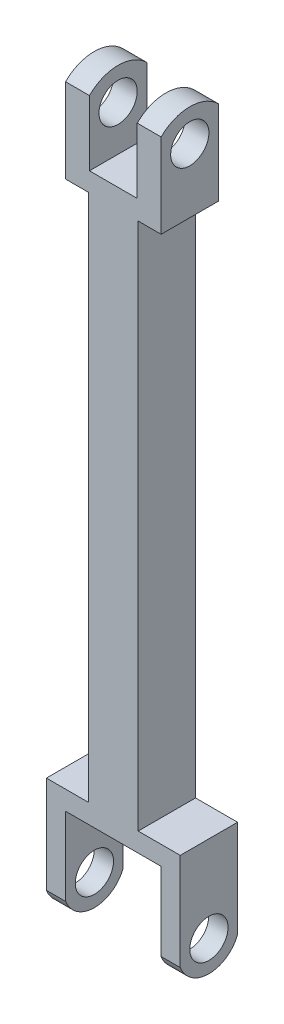
ISO-10303-21;
HEADER;
FILE_DESCRIPTION(('STEP AP214'),'2;1');
FILE_NAME('part.step','',(''),(''),'','','');
FILE_SCHEMA(('AUTOMOTIVE_DESIGN { 1 0 10303 214 1 1 1 1 }'));
ENDSEC;
DATA;
#1=APPLICATION_CONTEXT('core data for automotive mechanical design processes');
#2=APPLICATION_PROTOCOL_DEFINITION('international standard','automotive_design',2000,#1);
#3=PRODUCT_CONTEXT('',#1,'mechanical');
#4=PRODUCT('Part','Part','',(#3));
#5=PRODUCT_RELATED_PRODUCT_CATEGORY('part','',(#4));
#6=PRODUCT_DEFINITION_FORMATION('','',#4);
#7=PRODUCT_DEFINITION_CONTEXT('part definition',#1,'design');
#8=PRODUCT_DEFINITION('design','',#6,#7);
#9=PRODUCT_DEFINITION_SHAPE('','',#8);
#10=(LENGTH_UNIT() NAMED_UNIT(*) SI_UNIT(.MILLI.,.METRE.));
#11=(NAMED_UNIT(*) PLANE_ANGLE_UNIT() SI_UNIT($,.RADIAN.));
#12=(NAMED_UNIT(*) SI_UNIT($,.STERADIAN.) SOLID_ANGLE_UNIT());
#13=UNCERTAINTY_MEASURE_WITH_UNIT(LENGTH_MEASURE(1.E-05),#10,'distance_accuracy_value','');
#14=(GEOMETRIC_REPRESENTATION_CONTEXT(3) GLOBAL_UNCERTAINTY_ASSIGNED_CONTEXT((#13)) GLOBAL_UNIT_ASSIGNED_CONTEXT((#10,
#11,#12)) REPRESENTATION_CONTEXT('',''));
#15=CARTESIAN_POINT('',(0.,0.,0.));
#16=DIRECTION('',(0.,0.,1.));
#17=DIRECTION('',(1.,0.,0.));
#18=AXIS2_PLACEMENT_3D('',#15,#16,#17);
#19=CARTESIAN_POINT('',(2.99221219861622,70.4144146573449,1.5));
#20=DIRECTION('',(-1.,0.,0.));
#21=DIRECTION('',(0.,0.,1.));
#22=AXIS2_PLACEMENT_3D('',#19,#20,#21);
#23=CYLINDRICAL_SURFACE('',#22,1.);
#24=CARTESIAN_POINT('',(-9.75778780138378,70.4144146573449,1.5));
#25=DIRECTION('',(-1.,0.,0.));
#26=DIRECTION('',(0.,0.,1.));
#27=AXIS2_PLACEMENT_3D('',#24,#25,#26);
#28=CIRCLE('',#27,1.);
#29=CARTESIAN_POINT('',(-9.75778780138378,70.4144146573449,2.5));
#30=VERTEX_POINT('',#29);
#31=EDGE_CURVE('E242',#30,#30,#28,.F.);
#32=ORIENTED_EDGE('',*,*,#31,.T.);
#33=EDGE_LOOP('',(#32));
#34=FACE_BOUND('',#33,.T.);
#35=CARTESIAN_POINT('',(-11.0077878013838,70.4144146573449,1.5));
#36=DIRECTION('',(1.,0.,0.));
#37=DIRECTION('',(0.,1.,0.));
#38=AXIS2_PLACEMENT_3D('',#35,#36,#37);
#39=CIRCLE('',#38,1.);
#40=CARTESIAN_POINT('',(-11.0077878013838,71.4144146573449,1.5));
#41=VERTEX_POINT('',#40);
#42=EDGE_CURVE('E219',#41,#41,#39,.T.);
#43=ORIENTED_EDGE('',*,*,#42,.F.);
#44=EDGE_LOOP('',(#43));
#45=FACE_BOUND('',#44,.T.);
#46=ADVANCED_FACE('F37',(#34,#45),#23,.F.);
#47=CARTESIAN_POINT('',(2.99221219861622,69.966881410406,1.5));
#48=DIRECTION('',(-1.,0.,0.));
#49=DIRECTION('',(0.,0.,1.));
#50=AXIS2_PLACEMENT_3D('',#47,#48,#49);
#51=CYLINDRICAL_SURFACE('',#50,2.12414260230862);
#52=DIRECTION('',(-1.,0.,0.));
#53=VECTOR('',#52,1.);
#54=CARTESIAN_POINT('',(2.99221219861622,71.4708700390007,3.));
#55=LINE('',#54,#53);
#56=CARTESIAN_POINT('',(-9.75778780138378,71.4708700390007,3.));
#57=VERTEX_POINT('',#56);
#58=CARTESIAN_POINT('',(-11.0077878013838,71.4708700390007,3.));
#59=VERTEX_POINT('',#58);
#60=EDGE_CURVE('E233',#57,#59,#55,.T.);
#61=ORIENTED_EDGE('',*,*,#60,.F.);
#62=CARTESIAN_POINT('',(-9.75778780138378,69.966881410406,1.5));
#63=DIRECTION('',(-1.,0.,0.));
#64=DIRECTION('',(0.,0.,1.));
#65=AXIS2_PLACEMENT_3D('',#62,#63,#64);
#66=CIRCLE('',#65,2.12414260230862);
#67=CARTESIAN_POINT('',(-9.75778780138378,71.4708700390007,0.));
#68=VERTEX_POINT('',#67);
#69=EDGE_CURVE('E45',#57,#68,#66,.T.);
#70=ORIENTED_EDGE('',*,*,#69,.T.);
#71=DIRECTION('',(-1.,0.,0.));
#72=VECTOR('',#71,1.);
#73=CARTESIAN_POINT('',(2.99221219861622,71.4708700390007,0.));
#74=LINE('',#73,#72);
#75=CARTESIAN_POINT('',(-11.0077878013838,71.4708700390007,0.));
#76=VERTEX_POINT('',#75);
#77=EDGE_CURVE('E224',#68,#76,#74,.T.);
#78=ORIENTED_EDGE('',*,*,#77,.T.);
#79=CARTESIAN_POINT('',(-11.0077878013838,69.966881410406,1.5));
#80=DIRECTION('',(1.,0.,0.));
#81=DIRECTION('',(0.,1.,0.));
#82=AXIS2_PLACEMENT_3D('',#79,#80,#81);
#83=CIRCLE('',#82,2.12414260230862);
#84=EDGE_CURVE('E200',#59,#76,#83,.F.);
#85=ORIENTED_EDGE('',*,*,#84,.F.);
#86=EDGE_LOOP('',(#61,#70,#78,#85));
#87=FACE_BOUND('',#86,.T.);
#88=ADVANCED_FACE('F232',(#87),#51,.T.);
#89=CARTESIAN_POINT('',(-11.0077878013838,72.4285297549592,3.));
#90=DIRECTION('',(1.,0.,0.));
#91=DIRECTION('',(0.,1.,0.));
#92=AXIS2_PLACEMENT_3D('',#89,#90,#91);
#93=PLANE('',#92);
#94=ORIENTED_EDGE('',*,*,#42,.T.);
#95=EDGE_LOOP('',(#94));
#96=FACE_BOUND('',#95,.T.);
#97=DIRECTION('',(0.,-1.,0.));
#98=VECTOR('',#97,1.);
#99=CARTESIAN_POINT('',(-11.0077878013838,72.4285297549592,0.));
#100=LINE('',#99,#98);
#101=CARTESIAN_POINT('',(-11.0077878013838,67.061284765492,0.));
#102=VERTEX_POINT('',#101);
#103=EDGE_CURVE('E193',#76,#102,#100,.T.);
#104=ORIENTED_EDGE('',*,*,#103,.T.);
#105=DIRECTION('',(0.,0.,1.));
#106=VECTOR('',#105,1.);
#107=CARTESIAN_POINT('',(-11.0077878013838,67.061284765492,-0.001000000000001));
#108=LINE('',#107,#106);
#109=CARTESIAN_POINT('',(-11.0077878013838,67.061284765492,3.));
#110=VERTEX_POINT('',#109);
#111=EDGE_CURVE('E174',#102,#110,#108,.T.);
#112=ORIENTED_EDGE('',*,*,#111,.T.);
#113=DIRECTION('',(0.,-1.,0.));
#114=VECTOR('',#113,1.);
#115=CARTESIAN_POINT('',(-11.0077878013838,72.4285297549592,3.));
#116=LINE('',#115,#114);
#117=EDGE_CURVE('E203',#59,#110,#116,.T.);
#118=ORIENTED_EDGE('',*,*,#117,.F.);
#119=ORIENTED_EDGE('',*,*,#84,.T.);
#120=EDGE_LOOP('',(#104,#112,#118,#119));
#121=FACE_BOUND('',#120,.T.);
#122=ADVANCED_FACE('F39',(#96,#121),#93,.F.);
#123=CARTESIAN_POINT('',(-6.00778780138378,72.4285297549592,3.));
#124=DIRECTION('',(-1.,0.,0.));
#125=DIRECTION('',(0.,-1.,0.));
#126=AXIS2_PLACEMENT_3D('',#123,#124,#125);
#127=PLANE('',#126);
#128=CARTESIAN_POINT('',(-6.00778780138378,70.4144146573449,1.5));
#129=DIRECTION('',(-1.,0.,0.));
#130=DIRECTION('',(0.,-1.,0.));
#131=AXIS2_PLACEMENT_3D('',#128,#129,#130);
#132=CIRCLE('',#131,1.);
#133=CARTESIAN_POINT('',(-6.00778780138378,69.4144146573449,1.5));
#134=VERTEX_POINT('',#133);
#135=EDGE_CURVE('E216',#134,#134,#132,.T.);
#136=ORIENTED_EDGE('',*,*,#135,.T.);
#137=EDGE_LOOP('',(#136));
#138=FACE_BOUND('',#137,.T.);
#139=DIRECTION('',(0.,1.,0.));
#140=VECTOR('',#139,1.);
#141=CARTESIAN_POINT('',(-6.00778780138378,72.4285297549592,3.));
#142=LINE('',#141,#140);
#143=CARTESIAN_POINT('',(-6.00778780138377,67.061284765492,3.));
#144=VERTEX_POINT('',#143);
#145=CARTESIAN_POINT('',(-6.00778780138378,71.4708700390007,3.));
#146=VERTEX_POINT('',#145);
#147=EDGE_CURVE('E208',#144,#146,#142,.T.);
#148=ORIENTED_EDGE('',*,*,#147,.F.);
#149=DIRECTION('',(0.,0.,1.));
#150=VECTOR('',#149,1.);
#151=CARTESIAN_POINT('',(-6.00778780138377,67.061284765492,-0.001000000000001));
#152=LINE('',#151,#150);
#153=CARTESIAN_POINT('',(-6.00778780138378,67.061284765492,0.));
#154=VERTEX_POINT('',#153);
#155=EDGE_CURVE('E422',#154,#144,#152,.T.);
#156=ORIENTED_EDGE('',*,*,#155,.F.);
#157=DIRECTION('',(0.,1.,0.));
#158=VECTOR('',#157,1.);
#159=CARTESIAN_POINT('',(-6.00778780138378,72.4285297549592,0.));
#160=LINE('',#159,#158);
#161=CARTESIAN_POINT('',(-6.00778780138378,71.4708700390007,0.));
#162=VERTEX_POINT('',#161);
#163=EDGE_CURVE('E60',#154,#162,#160,.T.);
#164=ORIENTED_EDGE('',*,*,#163,.T.);
#165=CARTESIAN_POINT('',(-6.00778780138378,69.966881410406,1.5));
#166=DIRECTION('',(-1.,0.,0.));
#167=DIRECTION('',(0.,-1.,0.));
#168=AXIS2_PLACEMENT_3D('',#165,#166,#167);
#169=CIRCLE('',#168,2.12414260230862);
#170=EDGE_CURVE('E270',#162,#146,#169,.F.);
#171=ORIENTED_EDGE('',*,*,#170,.T.);
#172=EDGE_LOOP('',(#148,#156,#164,#171));
#173=FACE_BOUND('',#172,.T.);
#174=ADVANCED_FACE('F329',(#138,#173),#127,.F.);
#175=CARTESIAN_POINT('',(0.,0.,3.));
#176=DIRECTION('',(0.,0.,-1.));
#177=DIRECTION('',(-1.,0.,0.));
#178=AXIS2_PLACEMENT_3D('',#175,#176,#177);
#179=PLANE('',#178);
#180=ORIENTED_EDGE('',*,*,#117,.T.);
#181=DIRECTION('',(-1.,0.,0.));
#182=VECTOR('',#181,1.);
#183=CARTESIAN_POINT('',(-11.0077878013838,67.061284765492,3.));
#184=LINE('',#183,#182);
#185=CARTESIAN_POINT('',(-9.80778780138378,67.061284765492,3.));
#186=VERTEX_POINT('',#185);
#187=EDGE_CURVE('E180',#186,#110,#184,.T.);
#188=ORIENTED_EDGE('',*,*,#187,.F.);
#189=DIRECTION('',(0.,1.,0.));
#190=VECTOR('',#189,1.);
#191=CARTESIAN_POINT('',(-9.80778780138378,67.061284765492,3.));
#192=LINE('',#191,#190);
#193=CARTESIAN_POINT('',(-9.80778780138377,39.4285297549592,3.));
#194=VERTEX_POINT('',#193);
#195=EDGE_CURVE('E196',#194,#186,#192,.T.);
#196=ORIENTED_EDGE('',*,*,#195,.F.);
#197=DIRECTION('',(-1.,0.,0.));
#198=VECTOR('',#197,1.);
#199=CARTESIAN_POINT('',(-12.0077878013838,39.4285297549592,3.));
#200=LINE('',#199,#198);
#201=CARTESIAN_POINT('',(-12.0077878013838,39.4285297549592,3.));
#202=VERTEX_POINT('',#201);
#203=EDGE_CURVE('E311',#194,#202,#200,.T.);
#204=ORIENTED_EDGE('',*,*,#203,.T.);
#205=DIRECTION('',(0.,1.,0.));
#206=VECTOR('',#205,1.);
#207=CARTESIAN_POINT('',(-12.0077878013838,32.4285297549592,3.));
#208=LINE('',#207,#206);
#209=CARTESIAN_POINT('',(-12.0077878013838,34.3440242013483,3.));
#210=VERTEX_POINT('',#209);
#211=EDGE_CURVE('E314',#210,#202,#208,.T.);
#212=ORIENTED_EDGE('',*,*,#211,.F.);
#213=DIRECTION('',(-1.,0.,0.));
#214=VECTOR('',#213,1.);
#215=CARTESIAN_POINT('',(2.99221219861622,34.3440242013483,3.));
#216=LINE('',#215,#214);
#217=CARTESIAN_POINT('',(-10.9977878013838,34.3440242013483,3.));
#218=VERTEX_POINT('',#217);
#219=EDGE_CURVE('E256',#218,#210,#216,.T.);
#220=ORIENTED_EDGE('',*,*,#219,.F.);
#221=DIRECTION('',(0.,-1.,0.));
#222=VECTOR('',#221,1.);
#223=CARTESIAN_POINT('',(-10.9977878013838,32.4285297549592,3.));
#224=LINE('',#223,#222);
#225=CARTESIAN_POINT('',(-10.9977878013838,38.4285297549592,3.));
#226=VERTEX_POINT('',#225);
#227=EDGE_CURVE('E292',#226,#218,#224,.T.);
#228=ORIENTED_EDGE('',*,*,#227,.F.);
#229=DIRECTION('',(-1.,0.,0.));
#230=VECTOR('',#229,1.);
#231=CARTESIAN_POINT('',(-10.9977878013838,38.4285297549592,3.));
#232=LINE('',#231,#230);
#233=CARTESIAN_POINT('',(-6.01778780138378,38.4285297549592,3.));
#234=VERTEX_POINT('',#233);
#235=EDGE_CURVE('E289',#234,#226,#232,.T.);
#236=ORIENTED_EDGE('',*,*,#235,.F.);
#237=DIRECTION('',(0.,1.,0.));
#238=VECTOR('',#237,1.);
#239=CARTESIAN_POINT('',(-6.01778780138378,38.4285297549592,3.));
#240=LINE('',#239,#238);
#241=CARTESIAN_POINT('',(-6.01778780138378,34.3440242013483,3.));
#242=VERTEX_POINT('',#241);
#243=EDGE_CURVE('E287',#242,#234,#240,.T.);
#244=ORIENTED_EDGE('',*,*,#243,.F.);
#245=CARTESIAN_POINT('',(-5.00778780138378,34.3440242013483,3.));
#246=VERTEX_POINT('',#245);
#247=EDGE_CURVE('E258',#246,#242,#216,.T.);
#248=ORIENTED_EDGE('',*,*,#247,.F.);
#249=DIRECTION('',(0.,1.,0.));
#250=VECTOR('',#249,1.);
#251=CARTESIAN_POINT('',(-5.00778780138378,32.4285297549592,3.));
#252=LINE('',#251,#250);
#253=CARTESIAN_POINT('',(-5.00778780138378,39.4285297549592,3.));
#254=VERTEX_POINT('',#253);
#255=EDGE_CURVE('E316',#246,#254,#252,.T.);
#256=ORIENTED_EDGE('',*,*,#255,.T.);
#257=CARTESIAN_POINT('',(-7.20778780138377,39.4285297549592,3.));
#258=VERTEX_POINT('',#257);
#259=EDGE_CURVE('E312',#254,#258,#200,.T.);
#260=ORIENTED_EDGE('',*,*,#259,.T.);
#261=DIRECTION('',(0.,-1.,0.));
#262=VECTOR('',#261,1.);
#263=CARTESIAN_POINT('',(-7.20778780138378,67.061284765492,3.));
#264=LINE('',#263,#262);
#265=CARTESIAN_POINT('',(-7.20778780138378,67.061284765492,3.));
#266=VERTEX_POINT('',#265);
#267=EDGE_CURVE('E419',#266,#258,#264,.T.);
#268=ORIENTED_EDGE('',*,*,#267,.F.);
#269=DIRECTION('',(-1.,0.,0.));
#270=VECTOR('',#269,1.);
#271=CARTESIAN_POINT('',(-6.00778780138377,67.061284765492,3.));
#272=LINE('',#271,#270);
#273=EDGE_CURVE('E325',#144,#266,#272,.T.);
#274=ORIENTED_EDGE('',*,*,#273,.F.);
#275=ORIENTED_EDGE('',*,*,#147,.T.);
#276=CARTESIAN_POINT('',(-7.25778780138378,71.4708700390007,3.));
#277=VERTEX_POINT('',#276);
#278=EDGE_CURVE('E255',#146,#277,#55,.T.);
#279=ORIENTED_EDGE('',*,*,#278,.T.);
#280=DIRECTION('',(0.,1.,0.));
#281=VECTOR('',#280,1.);
#282=CARTESIAN_POINT('',(-7.25778780138378,72.3876973529333,3.));
#283=LINE('',#282,#281);
#284=CARTESIAN_POINT('',(-7.25778780138378,68.061284765492,3.));
#285=VERTEX_POINT('',#284);
#286=EDGE_CURVE('E52',#285,#277,#283,.T.);
#287=ORIENTED_EDGE('',*,*,#286,.F.);
#288=DIRECTION('',(1.,0.,0.));
#289=VECTOR('',#288,1.);
#290=CARTESIAN_POINT('',(-7.25778780138378,68.061284765492,3.));
#291=LINE('',#290,#289);
#292=CARTESIAN_POINT('',(-9.75778780138378,68.061284765492,3.));
#293=VERTEX_POINT('',#292);
#294=EDGE_CURVE('E185',#293,#285,#291,.T.);
#295=ORIENTED_EDGE('',*,*,#294,.F.);
#296=DIRECTION('',(0.,-1.,0.));
#297=VECTOR('',#296,1.);
#298=CARTESIAN_POINT('',(-9.75778780138378,68.061284765492,3.));
#299=LINE('',#298,#297);
#300=EDGE_CURVE('E431',#57,#293,#299,.T.);
#301=ORIENTED_EDGE('',*,*,#300,.F.);
#302=ORIENTED_EDGE('',*,*,#60,.T.);
#303=EDGE_LOOP('',(#180,#188,#196,#204,#212,#220,#228,#236,#244,#248,#256,#260,#268,#274,#275,
#279,#287,#295,#301,#302));
#304=FACE_BOUND('',#303,.T.);
#305=ADVANCED_FACE('F322',(#304),#179,.F.);
#306=CARTESIAN_POINT('',(0.,0.,0.));
#307=DIRECTION('',(0.,0.,-1.));
#308=DIRECTION('',(-1.,0.,0.));
#309=AXIS2_PLACEMENT_3D('',#306,#307,#308);
#310=PLANE('',#309);
#311=DIRECTION('',(-1.,0.,0.));
#312=VECTOR('',#311,1.);
#313=CARTESIAN_POINT('',(-11.0077878013838,67.061284765492,0.));
#314=LINE('',#313,#312);
#315=CARTESIAN_POINT('',(-9.80778780138378,67.061284765492,0.));
#316=VERTEX_POINT('',#315);
#317=EDGE_CURVE('E177',#316,#102,#314,.T.);
#318=ORIENTED_EDGE('',*,*,#317,.T.);
#319=ORIENTED_EDGE('',*,*,#103,.F.);
#320=ORIENTED_EDGE('',*,*,#77,.F.);
#321=DIRECTION('',(0.,1.,0.));
#322=VECTOR('',#321,1.);
#323=CARTESIAN_POINT('',(-9.75778780138378,0.,0.));
#324=LINE('',#323,#322);
#325=CARTESIAN_POINT('',(-9.75778780138378,68.061284765492,0.));
#326=VERTEX_POINT('',#325);
#327=EDGE_CURVE('E239',#326,#68,#324,.T.);
#328=ORIENTED_EDGE('',*,*,#327,.F.);
#329=DIRECTION('',(-1.,0.,0.));
#330=VECTOR('',#329,1.);
#331=CARTESIAN_POINT('',(0.,68.061284765492,0.));
#332=LINE('',#331,#330);
#333=CARTESIAN_POINT('',(-7.25778780138378,68.061284765492,0.));
#334=VERTEX_POINT('',#333);
#335=EDGE_CURVE('E11',#334,#326,#332,.T.);
#336=ORIENTED_EDGE('',*,*,#335,.F.);
#337=DIRECTION('',(0.,-1.,0.));
#338=VECTOR('',#337,1.);
#339=CARTESIAN_POINT('',(-7.25778780138378,0.,0.));
#340=LINE('',#339,#338);
#341=CARTESIAN_POINT('',(-7.25778780138378,71.4708700390007,0.));
#342=VERTEX_POINT('',#341);
#343=EDGE_CURVE('E248',#342,#334,#340,.T.);
#344=ORIENTED_EDGE('',*,*,#343,.F.);
#345=EDGE_CURVE('E225',#162,#342,#74,.T.);
#346=ORIENTED_EDGE('',*,*,#345,.F.);
#347=ORIENTED_EDGE('',*,*,#163,.F.);
#348=DIRECTION('',(-1.,0.,0.));
#349=VECTOR('',#348,1.);
#350=CARTESIAN_POINT('',(-6.00778780138377,67.061284765492,0.));
#351=LINE('',#350,#349);
#352=CARTESIAN_POINT('',(-7.20778780138378,67.061284765492,0.));
#353=VERTEX_POINT('',#352);
#354=EDGE_CURVE('E405',#154,#353,#351,.T.);
#355=ORIENTED_EDGE('',*,*,#354,.T.);
#356=DIRECTION('',(0.,-1.,0.));
#357=VECTOR('',#356,1.);
#358=CARTESIAN_POINT('',(-7.20778780138378,67.061284765492,0.));
#359=LINE('',#358,#357);
#360=CARTESIAN_POINT('',(-7.20778780138377,39.4285297549592,0.));
#361=VERTEX_POINT('',#360);
#362=EDGE_CURVE('E415',#353,#361,#359,.T.);
#363=ORIENTED_EDGE('',*,*,#362,.T.);
#364=DIRECTION('',(1.,0.,0.));
#365=VECTOR('',#364,1.);
#366=CARTESIAN_POINT('',(-5.00778780138378,39.4285297549592,0.));
#367=LINE('',#366,#365);
#368=CARTESIAN_POINT('',(-5.00778780138378,39.4285297549592,0.));
#369=VERTEX_POINT('',#368);
#370=EDGE_CURVE('E305',#361,#369,#367,.T.);
#371=ORIENTED_EDGE('',*,*,#370,.T.);
#372=DIRECTION('',(0.,1.,0.));
#373=VECTOR('',#372,1.);
#374=CARTESIAN_POINT('',(-5.00778780138378,32.4285297549592,0.));
#375=LINE('',#374,#373);
#376=CARTESIAN_POINT('',(-5.00778780138378,34.3440242013483,0.));
#377=VERTEX_POINT('',#376);
#378=EDGE_CURVE('E205',#377,#369,#375,.T.);
#379=ORIENTED_EDGE('',*,*,#378,.F.);
#380=DIRECTION('',(-1.,0.,0.));
#381=VECTOR('',#380,1.);
#382=CARTESIAN_POINT('',(2.99221219861622,34.3440242013483,0.));
#383=LINE('',#382,#381);
#384=CARTESIAN_POINT('',(-6.01778780138378,34.3440242013483,0.));
#385=VERTEX_POINT('',#384);
#386=EDGE_CURVE('E259',#377,#385,#383,.T.);
#387=ORIENTED_EDGE('',*,*,#386,.T.);
#388=DIRECTION('',(0.,1.,0.));
#389=VECTOR('',#388,1.);
#390=CARTESIAN_POINT('',(-6.01778780138378,38.4285297549592,0.));
#391=LINE('',#390,#389);
#392=CARTESIAN_POINT('',(-6.01778780138378,38.4285297549592,0.));
#393=VERTEX_POINT('',#392);
#394=EDGE_CURVE('E298',#385,#393,#391,.T.);
#395=ORIENTED_EDGE('',*,*,#394,.T.);
#396=DIRECTION('',(-1.,0.,0.));
#397=VECTOR('',#396,1.);
#398=CARTESIAN_POINT('',(-10.9977878013838,38.4285297549592,0.));
#399=LINE('',#398,#397);
#400=CARTESIAN_POINT('',(-10.9977878013838,38.4285297549592,0.));
#401=VERTEX_POINT('',#400);
#402=EDGE_CURVE('E281',#393,#401,#399,.T.);
#403=ORIENTED_EDGE('',*,*,#402,.T.);
#404=DIRECTION('',(0.,-1.,0.));
#405=VECTOR('',#404,1.);
#406=CARTESIAN_POINT('',(-10.9977878013838,32.4285297549592,0.));
#407=LINE('',#406,#405);
#408=CARTESIAN_POINT('',(-10.9977878013838,34.3440242013483,0.));
#409=VERTEX_POINT('',#408);
#410=EDGE_CURVE('E284',#401,#409,#407,.T.);
#411=ORIENTED_EDGE('',*,*,#410,.T.);
#412=CARTESIAN_POINT('',(-12.0077878013838,34.3440242013483,0.));
#413=VERTEX_POINT('',#412);
#414=EDGE_CURVE('E254',#409,#413,#383,.T.);
#415=ORIENTED_EDGE('',*,*,#414,.T.);
#416=DIRECTION('',(0.,1.,0.));
#417=VECTOR('',#416,1.);
#418=CARTESIAN_POINT('',(-12.0077878013838,32.4285297549592,0.));
#419=LINE('',#418,#417);
#420=CARTESIAN_POINT('',(-12.0077878013838,39.4285297549592,0.));
#421=VERTEX_POINT('',#420);
#422=EDGE_CURVE('E201',#413,#421,#419,.T.);
#423=ORIENTED_EDGE('',*,*,#422,.T.);
#424=CARTESIAN_POINT('',(-9.80778780138377,39.4285297549592,0.));
#425=VERTEX_POINT('',#424);
#426=EDGE_CURVE('E306',#421,#425,#367,.T.);
#427=ORIENTED_EDGE('',*,*,#426,.T.);
#428=DIRECTION('',(0.,1.,0.));
#429=VECTOR('',#428,1.);
#430=CARTESIAN_POINT('',(-9.80778780138378,67.061284765492,0.));
#431=LINE('',#430,#429);
#432=EDGE_CURVE('E195',#425,#316,#431,.T.);
#433=ORIENTED_EDGE('',*,*,#432,.T.);
#434=EDGE_LOOP('',(#318,#319,#320,#328,#336,#344,#346,#347,#355,#363,#371,#379,#387,#395,#403,
#411,#415,#423,#427,#433));
#435=FACE_BOUND('',#434,.T.);
#436=ADVANCED_FACE('F191',(#435),#310,.T.);
#437=CARTESIAN_POINT('',(0.,39.4285297549592,0.));
#438=DIRECTION('',(0.,1.,0.));
#439=DIRECTION('',(0.,0.,1.));
#440=AXIS2_PLACEMENT_3D('',#437,#438,#439);
#441=PLANE('',#440);
#442=ORIENTED_EDGE('',*,*,#370,.F.);
#443=DIRECTION('',(0.,0.,1.));
#444=VECTOR('',#443,1.);
#445=CARTESIAN_POINT('',(-7.20778780138377,39.4285297549592,-0.001000000000001));
#446=LINE('',#445,#444);
#447=EDGE_CURVE('E408',#361,#258,#446,.T.);
#448=ORIENTED_EDGE('',*,*,#447,.T.);
#449=ORIENTED_EDGE('',*,*,#259,.F.);
#450=DIRECTION('',(0.,0.,1.));
#451=VECTOR('',#450,1.);
#452=CARTESIAN_POINT('',(-5.00778780138378,39.4285297549592,3.));
#453=LINE('',#452,#451);
#454=EDGE_CURVE('E308',#369,#254,#453,.T.);
#455=ORIENTED_EDGE('',*,*,#454,.F.);
#456=EDGE_LOOP('',(#442,#448,#449,#455));
#457=FACE_BOUND('',#456,.T.);
#458=ADVANCED_FACE('F449',(#457),#441,.T.);
#459=CARTESIAN_POINT('',(-12.0077878013838,32.4285297549592,0.));
#460=DIRECTION('',(1.,0.,0.));
#461=DIRECTION('',(0.,0.,-1.));
#462=AXIS2_PLACEMENT_3D('',#459,#460,#461);
#463=PLANE('',#462);
#464=CARTESIAN_POINT('',(-12.0077878013838,34.9179089791142,1.5));
#465=DIRECTION('',(-1.,0.,0.));
#466=DIRECTION('',(0.,0.,1.));
#467=AXIS2_PLACEMENT_3D('',#464,#465,#466);
#468=CIRCLE('',#467,1.);
#469=CARTESIAN_POINT('',(-12.0077878013838,34.9179089791142,2.5));
#470=VERTEX_POINT('',#469);
#471=EDGE_CURVE('E215',#470,#470,#468,.T.);
#472=ORIENTED_EDGE('',*,*,#471,.F.);
#473=EDGE_LOOP('',(#472));
#474=FACE_BOUND('',#473,.T.);
#475=ORIENTED_EDGE('',*,*,#422,.F.);
#476=CARTESIAN_POINT('',(-12.0077878013838,34.9179089791142,1.5));
#477=DIRECTION('',(1.,0.,0.));
#478=DIRECTION('',(0.,0.,1.));
#479=AXIS2_PLACEMENT_3D('',#476,#477,#478);
#480=CIRCLE('',#479,1.60603354203809);
#481=EDGE_CURVE('E252',#210,#413,#480,.T.);
#482=ORIENTED_EDGE('',*,*,#481,.F.);
#483=ORIENTED_EDGE('',*,*,#211,.T.);
#484=DIRECTION('',(0.,0.,-1.));
#485=VECTOR('',#484,1.);
#486=CARTESIAN_POINT('',(-12.0077878013838,39.4285297549592,0.));
#487=LINE('',#486,#485);
#488=EDGE_CURVE('E302',#202,#421,#487,.T.);
#489=ORIENTED_EDGE('',*,*,#488,.T.);
#490=EDGE_LOOP('',(#475,#482,#483,#489));
#491=FACE_BOUND('',#490,.T.);
#492=ADVANCED_FACE('F392',(#474,#491),#463,.F.);
#493=CARTESIAN_POINT('',(-5.00778780138378,32.4285297549592,3.));
#494=DIRECTION('',(-1.,0.,0.));
#495=DIRECTION('',(0.,0.,1.));
#496=AXIS2_PLACEMENT_3D('',#493,#494,#495);
#497=PLANE('',#496);
#498=CARTESIAN_POINT('',(-5.00778780138378,34.9179089791142,1.5));
#499=DIRECTION('',(-1.,0.,0.));
#500=DIRECTION('',(0.,0.,1.));
#501=AXIS2_PLACEMENT_3D('',#498,#499,#500);
#502=CIRCLE('',#501,1.);
#503=CARTESIAN_POINT('',(-5.00778780138378,34.9179089791142,2.5));
#504=VERTEX_POINT('',#503);
#505=EDGE_CURVE('E220',#504,#504,#502,.T.);
#506=ORIENTED_EDGE('',*,*,#505,.T.);
#507=EDGE_LOOP('',(#506));
#508=FACE_BOUND('',#507,.T.);
#509=ORIENTED_EDGE('',*,*,#255,.F.);
#510=CARTESIAN_POINT('',(-5.00778780138378,34.9179089791142,1.5));
#511=DIRECTION('',(-1.,0.,0.));
#512=DIRECTION('',(0.,0.,1.));
#513=AXIS2_PLACEMENT_3D('',#510,#511,#512);
#514=CIRCLE('',#513,1.60603354203809);
#515=EDGE_CURVE('E267',#246,#377,#514,.F.);
#516=ORIENTED_EDGE('',*,*,#515,.T.);
#517=ORIENTED_EDGE('',*,*,#378,.T.);
#518=ORIENTED_EDGE('',*,*,#454,.T.);
#519=EDGE_LOOP('',(#509,#516,#517,#518));
#520=FACE_BOUND('',#519,.T.);
#521=ADVANCED_FACE('F456',(#508,#520),#497,.F.);
#522=ORIENTED_EDGE('',*,*,#203,.F.);
#523=DIRECTION('',(0.,0.,1.));
#524=VECTOR('',#523,1.);
#525=CARTESIAN_POINT('',(-9.80778780138377,39.4285297549592,-0.001000000000001));
#526=LINE('',#525,#524);
#527=EDGE_CURVE('E402',#425,#194,#526,.T.);
#528=ORIENTED_EDGE('',*,*,#527,.F.);
#529=ORIENTED_EDGE('',*,*,#426,.F.);
#530=ORIENTED_EDGE('',*,*,#488,.F.);
#531=EDGE_LOOP('',(#522,#528,#529,#530));
#532=FACE_BOUND('',#531,.T.);
#533=ADVANCED_FACE('F401',(#532),#441,.T.);
#534=CARTESIAN_POINT('',(-10.9977878013838,32.4285297549592,-0.001000000000001));
#535=DIRECTION('',(-1.,0.,0.));
#536=DIRECTION('',(0.,-1.,0.));
#537=AXIS2_PLACEMENT_3D('',#534,#535,#536);
#538=PLANE('',#537);
#539=CARTESIAN_POINT('',(-10.9977878013838,34.9179089791142,1.5));
#540=DIRECTION('',(-1.,0.,0.));
#541=DIRECTION('',(0.,-1.,0.));
#542=AXIS2_PLACEMENT_3D('',#539,#540,#541);
#543=CIRCLE('',#542,1.);
#544=CARTESIAN_POINT('',(-10.9977878013838,33.9179089791142,1.5));
#545=VERTEX_POINT('',#544);
#546=EDGE_CURVE('E214',#545,#545,#543,.T.);
#547=ORIENTED_EDGE('',*,*,#546,.T.);
#548=EDGE_LOOP('',(#547));
#549=FACE_BOUND('',#548,.T.);
#550=ORIENTED_EDGE('',*,*,#227,.T.);
#551=CARTESIAN_POINT('',(-10.9977878013838,34.9179089791142,1.5));
#552=DIRECTION('',(-1.,0.,0.));
#553=DIRECTION('',(0.,-1.,0.));
#554=AXIS2_PLACEMENT_3D('',#551,#552,#553);
#555=CIRCLE('',#554,1.60603354203809);
#556=EDGE_CURVE('E264',#218,#409,#555,.F.);
#557=ORIENTED_EDGE('',*,*,#556,.T.);
#558=ORIENTED_EDGE('',*,*,#410,.F.);
#559=DIRECTION('',(0.,0.,1.));
#560=VECTOR('',#559,1.);
#561=CARTESIAN_POINT('',(-10.9977878013838,38.4285297549592,-0.001000000000001));
#562=LINE('',#561,#560);
#563=EDGE_CURVE('E296',#401,#226,#562,.T.);
#564=ORIENTED_EDGE('',*,*,#563,.T.);
#565=EDGE_LOOP('',(#550,#557,#558,#564));
#566=FACE_BOUND('',#565,.T.);
#567=ADVANCED_FACE('F468',(#549,#566),#538,.F.);
#568=CARTESIAN_POINT('',(-10.9977878013838,38.4285297549592,-0.001000000000001));
#569=DIRECTION('',(0.,1.,0.));
#570=DIRECTION('',(0.,0.,1.));
#571=AXIS2_PLACEMENT_3D('',#568,#569,#570);
#572=PLANE('',#571);
#573=DIRECTION('',(0.,0.,1.));
#574=VECTOR('',#573,1.);
#575=CARTESIAN_POINT('',(-6.01778780138378,38.4285297549592,-0.001000000000001));
#576=LINE('',#575,#574);
#577=EDGE_CURVE('E295',#393,#234,#576,.T.);
#578=ORIENTED_EDGE('',*,*,#577,.T.);
#579=ORIENTED_EDGE('',*,*,#235,.T.);
#580=ORIENTED_EDGE('',*,*,#563,.F.);
#581=ORIENTED_EDGE('',*,*,#402,.F.);
#582=EDGE_LOOP('',(#578,#579,#580,#581));
#583=FACE_BOUND('',#582,.T.);
#584=ADVANCED_FACE('F465',(#583),#572,.F.);
#585=CARTESIAN_POINT('',(-6.01778780138378,38.4285297549592,-0.001000000000001));
#586=DIRECTION('',(1.,0.,0.));
#587=DIRECTION('',(0.,1.,0.));
#588=AXIS2_PLACEMENT_3D('',#585,#586,#587);
#589=PLANE('',#588);
#590=CARTESIAN_POINT('',(-6.01778780138378,34.9179089791142,1.5));
#591=DIRECTION('',(1.,0.,0.));
#592=DIRECTION('',(0.,1.,0.));
#593=AXIS2_PLACEMENT_3D('',#590,#591,#592);
#594=CIRCLE('',#593,1.);
#595=CARTESIAN_POINT('',(-6.01778780138378,35.9179089791142,1.5));
#596=VERTEX_POINT('',#595);
#597=EDGE_CURVE('E211',#596,#596,#594,.T.);
#598=ORIENTED_EDGE('',*,*,#597,.T.);
#599=EDGE_LOOP('',(#598));
#600=FACE_BOUND('',#599,.T.);
#601=ORIENTED_EDGE('',*,*,#394,.F.);
#602=CARTESIAN_POINT('',(-6.01778780138378,34.9179089791142,1.5));
#603=DIRECTION('',(1.,0.,0.));
#604=DIRECTION('',(0.,1.,0.));
#605=AXIS2_PLACEMENT_3D('',#602,#603,#604);
#606=CIRCLE('',#605,1.60603354203809);
#607=EDGE_CURVE('E221',#385,#242,#606,.F.);
#608=ORIENTED_EDGE('',*,*,#607,.T.);
#609=ORIENTED_EDGE('',*,*,#243,.T.);
#610=ORIENTED_EDGE('',*,*,#577,.F.);
#611=EDGE_LOOP('',(#601,#608,#609,#610));
#612=FACE_BOUND('',#611,.T.);
#613=ADVANCED_FACE('F462',(#600,#612),#589,.F.);
#614=CARTESIAN_POINT('',(2.99221219861622,34.9179089791142,1.5));
#615=DIRECTION('',(-1.,0.,0.));
#616=DIRECTION('',(0.,0.,1.));
#617=AXIS2_PLACEMENT_3D('',#614,#615,#616);
#618=CYLINDRICAL_SURFACE('',#617,1.);
#619=ORIENTED_EDGE('',*,*,#597,.F.);
#620=EDGE_LOOP('',(#619));
#621=FACE_BOUND('',#620,.T.);
#622=ORIENTED_EDGE('',*,*,#505,.F.);
#623=EDGE_LOOP('',(#622));
#624=FACE_BOUND('',#623,.T.);
#625=ADVANCED_FACE('F362',(#621,#624),#618,.F.);
#626=ORIENTED_EDGE('',*,*,#471,.T.);
#627=EDGE_LOOP('',(#626));
#628=FACE_BOUND('',#627,.T.);
#629=ORIENTED_EDGE('',*,*,#546,.F.);
#630=EDGE_LOOP('',(#629));
#631=FACE_BOUND('',#630,.T.);
#632=ADVANCED_FACE('F352',(#628,#631),#618,.F.);
#633=CARTESIAN_POINT('',(-7.25778780138378,70.4144146573449,1.5));
#634=DIRECTION('',(1.,0.,0.));
#635=DIRECTION('',(0.,0.,-1.));
#636=AXIS2_PLACEMENT_3D('',#633,#634,#635);
#637=CIRCLE('',#636,1.);
#638=CARTESIAN_POINT('',(-7.25778780138378,70.4144146573449,0.499999999999998));
#639=VERTEX_POINT('',#638);
#640=EDGE_CURVE('E243',#639,#639,#637,.F.);
#641=ORIENTED_EDGE('',*,*,#640,.T.);
#642=EDGE_LOOP('',(#641));
#643=FACE_BOUND('',#642,.T.);
#644=ORIENTED_EDGE('',*,*,#135,.F.);
#645=EDGE_LOOP('',(#644));
#646=FACE_BOUND('',#645,.T.);
#647=ADVANCED_FACE('F342',(#643,#646),#23,.F.);
#648=CARTESIAN_POINT('',(2.99221219861622,34.9179089791142,1.5));
#649=DIRECTION('',(-1.,0.,0.));
#650=DIRECTION('',(0.,0.,1.));
#651=AXIS2_PLACEMENT_3D('',#648,#649,#650);
#652=CYLINDRICAL_SURFACE('',#651,1.60603354203809);
#653=ORIENTED_EDGE('',*,*,#247,.T.);
#654=ORIENTED_EDGE('',*,*,#607,.F.);
#655=ORIENTED_EDGE('',*,*,#386,.F.);
#656=ORIENTED_EDGE('',*,*,#515,.F.);
#657=EDGE_LOOP('',(#653,#654,#655,#656));
#658=FACE_BOUND('',#657,.T.);
#659=ADVANCED_FACE('F351',(#658),#652,.T.);
#660=ORIENTED_EDGE('',*,*,#219,.T.);
#661=ORIENTED_EDGE('',*,*,#481,.T.);
#662=ORIENTED_EDGE('',*,*,#414,.F.);
#663=ORIENTED_EDGE('',*,*,#556,.F.);
#664=EDGE_LOOP('',(#660,#661,#662,#663));
#665=FACE_BOUND('',#664,.T.);
#666=ADVANCED_FACE('F358',(#665),#652,.T.);
#667=ORIENTED_EDGE('',*,*,#345,.T.);
#668=CARTESIAN_POINT('',(-7.25778780138378,69.966881410406,1.5));
#669=DIRECTION('',(1.,0.,0.));
#670=DIRECTION('',(0.,0.,-1.));
#671=AXIS2_PLACEMENT_3D('',#668,#669,#670);
#672=CIRCLE('',#671,2.12414260230862);
#673=EDGE_CURVE('E228',#342,#277,#672,.T.);
#674=ORIENTED_EDGE('',*,*,#673,.T.);
#675=ORIENTED_EDGE('',*,*,#278,.F.);
#676=ORIENTED_EDGE('',*,*,#170,.F.);
#677=EDGE_LOOP('',(#667,#674,#675,#676));
#678=FACE_BOUND('',#677,.T.);
#679=ADVANCED_FACE('F327',(#678),#51,.T.);
#680=CARTESIAN_POINT('',(-9.75778780138378,68.061284765492,-7.));
#681=DIRECTION('',(-1.,0.,0.));
#682=DIRECTION('',(0.,0.,1.));
#683=AXIS2_PLACEMENT_3D('',#680,#681,#682);
#684=PLANE('',#683);
#685=ORIENTED_EDGE('',*,*,#327,.T.);
#686=ORIENTED_EDGE('',*,*,#69,.F.);
#687=ORIENTED_EDGE('',*,*,#300,.T.);
#688=DIRECTION('',(0.,0.,1.));
#689=VECTOR('',#688,1.);
#690=CARTESIAN_POINT('',(-9.75778780138378,68.061284765492,-7.));
#691=LINE('',#690,#689);
#692=EDGE_CURVE('E434',#326,#293,#691,.T.);
#693=ORIENTED_EDGE('',*,*,#692,.F.);
#694=EDGE_LOOP('',(#685,#686,#687,#693));
#695=FACE_BOUND('',#694,.T.);
#696=ORIENTED_EDGE('',*,*,#31,.F.);
#697=EDGE_LOOP('',(#696));
#698=FACE_BOUND('',#697,.T.);
#699=ADVANCED_FACE('F371',(#695,#698),#684,.F.);
#700=CARTESIAN_POINT('',(-7.25778780138378,72.3876973529333,-7.));
#701=DIRECTION('',(1.,0.,0.));
#702=DIRECTION('',(0.,0.,-1.));
#703=AXIS2_PLACEMENT_3D('',#700,#701,#702);
#704=PLANE('',#703);
#705=ORIENTED_EDGE('',*,*,#343,.T.);
#706=DIRECTION('',(0.,0.,1.));
#707=VECTOR('',#706,1.);
#708=CARTESIAN_POINT('',(-7.25778780138378,68.061284765492,-7.));
#709=LINE('',#708,#707);
#710=EDGE_CURVE('E433',#334,#285,#709,.T.);
#711=ORIENTED_EDGE('',*,*,#710,.T.);
#712=ORIENTED_EDGE('',*,*,#286,.T.);
#713=ORIENTED_EDGE('',*,*,#673,.F.);
#714=EDGE_LOOP('',(#705,#711,#712,#713));
#715=FACE_BOUND('',#714,.T.);
#716=ORIENTED_EDGE('',*,*,#640,.F.);
#717=EDGE_LOOP('',(#716));
#718=FACE_BOUND('',#717,.T.);
#719=ADVANCED_FACE('F368',(#715,#718),#704,.F.);
#720=CARTESIAN_POINT('',(-7.25778780138378,68.061284765492,-7.));
#721=DIRECTION('',(0.,-1.,0.));
#722=DIRECTION('',(0.,0.,-1.));
#723=AXIS2_PLACEMENT_3D('',#720,#721,#722);
#724=PLANE('',#723);
#725=ORIENTED_EDGE('',*,*,#335,.T.);
#726=ORIENTED_EDGE('',*,*,#692,.T.);
#727=ORIENTED_EDGE('',*,*,#294,.T.);
#728=ORIENTED_EDGE('',*,*,#710,.F.);
#729=EDGE_LOOP('',(#725,#726,#727,#728));
#730=FACE_BOUND('',#729,.T.);
#731=ADVANCED_FACE('F370',(#730),#724,.F.);
#732=CARTESIAN_POINT('',(-11.0077878013838,67.061284765492,-0.001000000000001));
#733=DIRECTION('',(0.,1.,0.));
#734=DIRECTION('',(0.,0.,1.));
#735=AXIS2_PLACEMENT_3D('',#732,#733,#734);
#736=PLANE('',#735);
#737=DIRECTION('',(0.,0.,1.));
#738=VECTOR('',#737,1.);
#739=CARTESIAN_POINT('',(-9.80778780138378,67.061284765492,-0.001000000000001));
#740=LINE('',#739,#738);
#741=EDGE_CURVE('E186',#316,#186,#740,.T.);
#742=ORIENTED_EDGE('',*,*,#741,.T.);
#743=ORIENTED_EDGE('',*,*,#187,.T.);
#744=ORIENTED_EDGE('',*,*,#111,.F.);
#745=ORIENTED_EDGE('',*,*,#317,.F.);
#746=EDGE_LOOP('',(#742,#743,#744,#745));
#747=FACE_BOUND('',#746,.T.);
#748=ADVANCED_FACE('F176',(#747),#736,.F.);
#749=CARTESIAN_POINT('',(-9.80778780138378,67.061284765492,-0.001000000000001));
#750=DIRECTION('',(1.,0.,0.));
#751=DIRECTION('',(0.,1.,0.));
#752=AXIS2_PLACEMENT_3D('',#749,#750,#751);
#753=PLANE('',#752);
#754=ORIENTED_EDGE('',*,*,#527,.T.);
#755=ORIENTED_EDGE('',*,*,#195,.T.);
#756=ORIENTED_EDGE('',*,*,#741,.F.);
#757=ORIENTED_EDGE('',*,*,#432,.F.);
#758=EDGE_LOOP('',(#754,#755,#756,#757));
#759=FACE_BOUND('',#758,.T.);
#760=ADVANCED_FACE('F404',(#759),#753,.F.);
#761=CARTESIAN_POINT('',(-7.20778780138378,67.061284765492,-0.001000000000001));
#762=DIRECTION('',(-1.,0.,0.));
#763=DIRECTION('',(0.,-1.,0.));
#764=AXIS2_PLACEMENT_3D('',#761,#762,#763);
#765=PLANE('',#764);
#766=DIRECTION('',(0.,0.,1.));
#767=VECTOR('',#766,1.);
#768=CARTESIAN_POINT('',(-7.20778780138378,67.061284765492,-0.001000000000001));
#769=LINE('',#768,#767);
#770=EDGE_CURVE('E425',#353,#266,#769,.T.);
#771=ORIENTED_EDGE('',*,*,#770,.T.);
#772=ORIENTED_EDGE('',*,*,#267,.T.);
#773=ORIENTED_EDGE('',*,*,#447,.F.);
#774=ORIENTED_EDGE('',*,*,#362,.F.);
#775=EDGE_LOOP('',(#771,#772,#773,#774));
#776=FACE_BOUND('',#775,.T.);
#777=ADVANCED_FACE('F445',(#776),#765,.F.);
#778=CARTESIAN_POINT('',(-6.00778780138377,67.061284765492,-0.001000000000001));
#779=DIRECTION('',(0.,1.,0.));
#780=DIRECTION('',(0.,0.,1.));
#781=AXIS2_PLACEMENT_3D('',#778,#779,#780);
#782=PLANE('',#781);
#783=ORIENTED_EDGE('',*,*,#155,.T.);
#784=ORIENTED_EDGE('',*,*,#273,.T.);
#785=ORIENTED_EDGE('',*,*,#770,.F.);
#786=ORIENTED_EDGE('',*,*,#354,.F.);
#787=EDGE_LOOP('',(#783,#784,#785,#786));
#788=FACE_BOUND('',#787,.T.);
#789=ADVANCED_FACE('F443',(#788),#782,.F.);
#790=CLOSED_SHELL('',(#46,#88,#122,#174,#305,#436,#458,#492,#521,#533,#567,#584,#613,#625,#632,
#647,#659,#666,#679,#699,#719,#731,#748,#760,#777,#789));
#791=MANIFOLD_SOLID_BREP('B2',#790);
#792=ADVANCED_BREP_SHAPE_REPRESENTATION('',(#18,#791),#14);
#793=SHAPE_DEFINITION_REPRESENTATION(#9,#792);
ENDSEC;
END-ISO-10303-21;
